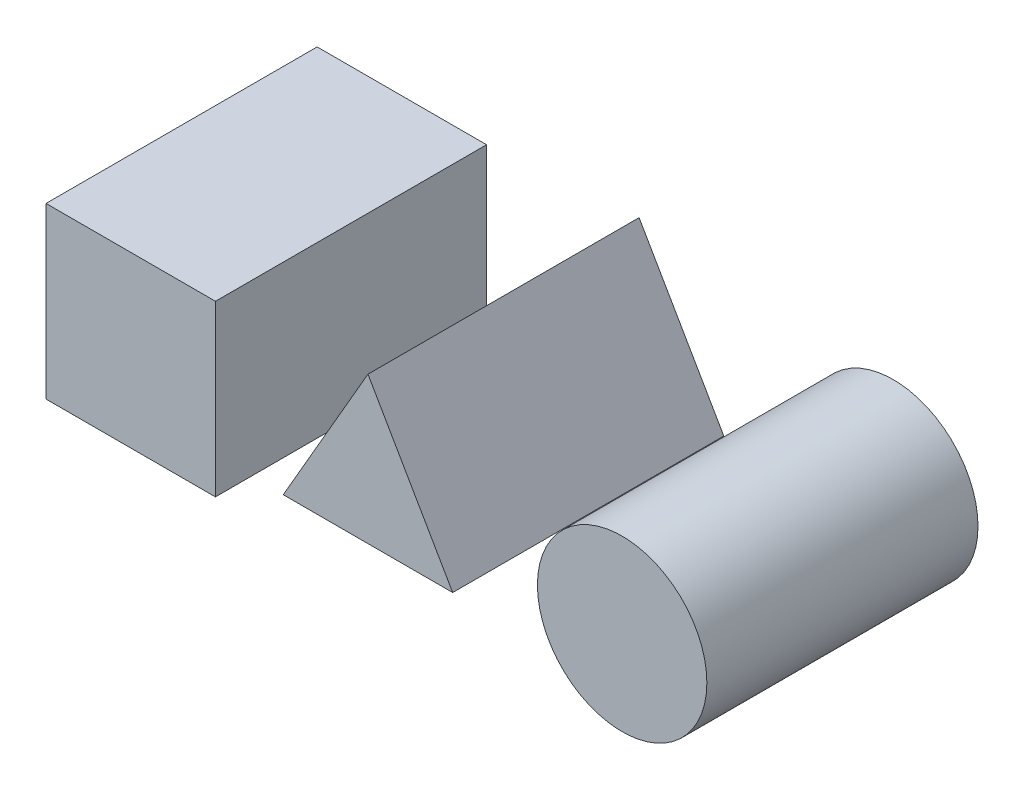
ISO-10303-21;
HEADER;
FILE_DESCRIPTION(('STEP AP214'),'2;1');
FILE_NAME('part.step','',(''),(''),'','','');
FILE_SCHEMA(('AUTOMOTIVE_DESIGN { 1 0 10303 214 1 1 1 1 }'));
ENDSEC;
DATA;
#1=APPLICATION_CONTEXT('core data for automotive mechanical design processes');
#2=APPLICATION_PROTOCOL_DEFINITION('international standard','automotive_design',2000,#1);
#3=PRODUCT_CONTEXT('',#1,'mechanical');
#4=PRODUCT('Part','Part','',(#3));
#5=PRODUCT_RELATED_PRODUCT_CATEGORY('part','',(#4));
#6=PRODUCT_DEFINITION_FORMATION('','',#4);
#7=PRODUCT_DEFINITION_CONTEXT('part definition',#1,'design');
#8=PRODUCT_DEFINITION('design','',#6,#7);
#9=PRODUCT_DEFINITION_SHAPE('','',#8);
#10=(LENGTH_UNIT() NAMED_UNIT(*) SI_UNIT(.MILLI.,.METRE.));
#11=(NAMED_UNIT(*) PLANE_ANGLE_UNIT() SI_UNIT($,.RADIAN.));
#12=(NAMED_UNIT(*) SI_UNIT($,.STERADIAN.) SOLID_ANGLE_UNIT());
#13=UNCERTAINTY_MEASURE_WITH_UNIT(LENGTH_MEASURE(1.E-05),#10,'distance_accuracy_value','');
#14=(GEOMETRIC_REPRESENTATION_CONTEXT(3) GLOBAL_UNCERTAINTY_ASSIGNED_CONTEXT((#13)) GLOBAL_UNIT_ASSIGNED_CONTEXT((#10,
#11,#12)) REPRESENTATION_CONTEXT('',''));
#15=CARTESIAN_POINT('',(0.,0.,0.));
#16=DIRECTION('',(0.,0.,1.));
#17=DIRECTION('',(1.,0.,0.));
#18=AXIS2_PLACEMENT_3D('',#15,#16,#17);
#19=CARTESIAN_POINT('',(74.9999999999999,0.,80.));
#20=DIRECTION('',(0.,0.,-1.));
#21=DIRECTION('',(-1.,0.,0.));
#22=AXIS2_PLACEMENT_3D('',#19,#20,#21);
#23=CYLINDRICAL_SURFACE('',#22,25.);
#24=CARTESIAN_POINT('',(74.9999999999999,0.,80.));
#25=DIRECTION('',(0.,0.,1.));
#26=DIRECTION('',(1.,0.,0.));
#27=AXIS2_PLACEMENT_3D('',#24,#25,#26);
#28=CIRCLE('',#27,25.);
#29=CARTESIAN_POINT('',(99.9999999999999,0.,80.));
#30=VERTEX_POINT('',#29);
#31=EDGE_CURVE('E11',#30,#30,#28,.T.);
#32=ORIENTED_EDGE('',*,*,#31,.F.);
#33=EDGE_LOOP('',(#32));
#34=FACE_BOUND('',#33,.T.);
#35=CARTESIAN_POINT('',(74.9999999999999,0.,0.));
#36=DIRECTION('',(0.,0.,1.));
#37=DIRECTION('',(1.,0.,0.));
#38=AXIS2_PLACEMENT_3D('',#35,#36,#37);
#39=CIRCLE('',#38,25.);
#40=CARTESIAN_POINT('',(99.9999999999999,0.,0.));
#41=VERTEX_POINT('',#40);
#42=EDGE_CURVE('E51',#41,#41,#39,.T.);
#43=ORIENTED_EDGE('',*,*,#42,.T.);
#44=EDGE_LOOP('',(#43));
#45=FACE_BOUND('',#44,.T.);
#46=ADVANCED_FACE('F48',(#34,#45),#23,.T.);
#47=CARTESIAN_POINT('',(0.,0.,80.));
#48=DIRECTION('',(0.,0.,1.));
#49=DIRECTION('',(1.,0.,0.));
#50=AXIS2_PLACEMENT_3D('',#47,#48,#49);
#51=PLANE('',#50);
#52=ORIENTED_EDGE('',*,*,#31,.T.);
#53=EDGE_LOOP('',(#52));
#54=FACE_BOUND('',#53,.T.);
#55=ADVANCED_FACE('F63',(#54),#51,.T.);
#56=CARTESIAN_POINT('',(0.,0.,0.));
#57=DIRECTION('',(0.,0.,1.));
#58=DIRECTION('',(1.,0.,0.));
#59=AXIS2_PLACEMENT_3D('',#56,#57,#58);
#60=PLANE('',#59);
#61=ORIENTED_EDGE('',*,*,#42,.F.);
#62=EDGE_LOOP('',(#61));
#63=FACE_BOUND('',#62,.T.);
#64=ADVANCED_FACE('F61',(#63),#60,.F.);
#65=CLOSED_SHELL('',(#46,#55,#64));
#66=MANIFOLD_SOLID_BREP('B2',#65);
#67=CARTESIAN_POINT('',(-45.,0.,80.));
#68=DIRECTION('',(1.,0.,0.));
#69=DIRECTION('',(0.,0.,-1.));
#70=AXIS2_PLACEMENT_3D('',#67,#68,#69);
#71=PLANE('',#70);
#72=DIRECTION('',(0.,-1.,0.));
#73=VECTOR('',#72,1.);
#74=CARTESIAN_POINT('',(-45.,0.,0.));
#75=LINE('',#74,#73);
#76=CARTESIAN_POINT('',(-45.,25.,0.));
#77=VERTEX_POINT('',#76);
#78=CARTESIAN_POINT('',(-45.,-25.,0.));
#79=VERTEX_POINT('',#78);
#80=EDGE_CURVE('E161',#77,#79,#75,.T.);
#81=ORIENTED_EDGE('',*,*,#80,.F.);
#82=DIRECTION('',(0.,0.,-1.));
#83=VECTOR('',#82,1.);
#84=CARTESIAN_POINT('',(-45.,25.,80.));
#85=LINE('',#84,#83);
#86=CARTESIAN_POINT('',(-45.,25.,80.));
#87=VERTEX_POINT('',#86);
#88=EDGE_CURVE('E46',#87,#77,#85,.T.);
#89=ORIENTED_EDGE('',*,*,#88,.F.);
#90=DIRECTION('',(0.,-1.,0.));
#91=VECTOR('',#90,1.);
#92=CARTESIAN_POINT('',(-45.,0.,80.));
#93=LINE('',#92,#91);
#94=CARTESIAN_POINT('',(-45.,-25.,80.));
#95=VERTEX_POINT('',#94);
#96=EDGE_CURVE('E155',#87,#95,#93,.T.);
#97=ORIENTED_EDGE('',*,*,#96,.T.);
#98=DIRECTION('',(0.,0.,-1.));
#99=VECTOR('',#98,1.);
#100=CARTESIAN_POINT('',(-45.,-25.,80.));
#101=LINE('',#100,#99);
#102=EDGE_CURVE('E136',#95,#79,#101,.T.);
#103=ORIENTED_EDGE('',*,*,#102,.T.);
#104=EDGE_LOOP('',(#81,#89,#97,#103));
#105=FACE_BOUND('',#104,.T.);
#106=ADVANCED_FACE('F98',(#105),#71,.T.);
#107=CARTESIAN_POINT('',(0.,25.,80.));
#108=DIRECTION('',(0.,1.,0.));
#109=DIRECTION('',(0.,0.,1.));
#110=AXIS2_PLACEMENT_3D('',#107,#108,#109);
#111=PLANE('',#110);
#112=DIRECTION('',(1.,0.,0.));
#113=VECTOR('',#112,1.);
#114=CARTESIAN_POINT('',(0.,25.,0.));
#115=LINE('',#114,#113);
#116=CARTESIAN_POINT('',(-95.,25.,0.));
#117=VERTEX_POINT('',#116);
#118=EDGE_CURVE('E149',#117,#77,#115,.T.);
#119=ORIENTED_EDGE('',*,*,#118,.F.);
#120=DIRECTION('',(0.,0.,-1.));
#121=VECTOR('',#120,1.);
#122=CARTESIAN_POINT('',(-95.,25.,80.));
#123=LINE('',#122,#121);
#124=CARTESIAN_POINT('',(-95.,25.,80.));
#125=VERTEX_POINT('',#124);
#126=EDGE_CURVE('E106',#125,#117,#123,.T.);
#127=ORIENTED_EDGE('',*,*,#126,.F.);
#128=DIRECTION('',(1.,0.,0.));
#129=VECTOR('',#128,1.);
#130=CARTESIAN_POINT('',(0.,25.,80.));
#131=LINE('',#130,#129);
#132=EDGE_CURVE('E147',#125,#87,#131,.T.);
#133=ORIENTED_EDGE('',*,*,#132,.T.);
#134=ORIENTED_EDGE('',*,*,#88,.T.);
#135=EDGE_LOOP('',(#119,#127,#133,#134));
#136=FACE_BOUND('',#135,.T.);
#137=ADVANCED_FACE('F145',(#136),#111,.T.);
#138=CARTESIAN_POINT('',(-95.,0.,80.));
#139=DIRECTION('',(1.,0.,0.));
#140=DIRECTION('',(0.,0.,-1.));
#141=AXIS2_PLACEMENT_3D('',#138,#139,#140);
#142=PLANE('',#141);
#143=DIRECTION('',(0.,-1.,0.));
#144=VECTOR('',#143,1.);
#145=CARTESIAN_POINT('',(-95.,0.,0.));
#146=LINE('',#145,#144);
#147=CARTESIAN_POINT('',(-95.,-25.,0.));
#148=VERTEX_POINT('',#147);
#149=EDGE_CURVE('E129',#117,#148,#146,.T.);
#150=ORIENTED_EDGE('',*,*,#149,.T.);
#151=DIRECTION('',(0.,0.,-1.));
#152=VECTOR('',#151,1.);
#153=CARTESIAN_POINT('',(-95.,-25.,80.));
#154=LINE('',#153,#152);
#155=CARTESIAN_POINT('',(-95.,-25.,80.));
#156=VERTEX_POINT('',#155);
#157=EDGE_CURVE('E150',#156,#148,#154,.T.);
#158=ORIENTED_EDGE('',*,*,#157,.F.);
#159=DIRECTION('',(0.,-1.,0.));
#160=VECTOR('',#159,1.);
#161=CARTESIAN_POINT('',(-95.,0.,80.));
#162=LINE('',#161,#160);
#163=EDGE_CURVE('E151',#125,#156,#162,.T.);
#164=ORIENTED_EDGE('',*,*,#163,.F.);
#165=ORIENTED_EDGE('',*,*,#126,.T.);
#166=EDGE_LOOP('',(#150,#158,#164,#165));
#167=FACE_BOUND('',#166,.T.);
#168=ADVANCED_FACE('F152',(#167),#142,.F.);
#169=CARTESIAN_POINT('',(0.,-25.,80.));
#170=DIRECTION('',(0.,1.,0.));
#171=DIRECTION('',(0.,0.,1.));
#172=AXIS2_PLACEMENT_3D('',#169,#170,#171);
#173=PLANE('',#172);
#174=DIRECTION('',(1.,0.,0.));
#175=VECTOR('',#174,1.);
#176=CARTESIAN_POINT('',(0.,-25.,0.));
#177=LINE('',#176,#175);
#178=EDGE_CURVE('E157',#148,#79,#177,.T.);
#179=ORIENTED_EDGE('',*,*,#178,.T.);
#180=ORIENTED_EDGE('',*,*,#102,.F.);
#181=DIRECTION('',(1.,0.,0.));
#182=VECTOR('',#181,1.);
#183=CARTESIAN_POINT('',(0.,-25.,80.));
#184=LINE('',#183,#182);
#185=EDGE_CURVE('E114',#156,#95,#184,.T.);
#186=ORIENTED_EDGE('',*,*,#185,.F.);
#187=ORIENTED_EDGE('',*,*,#157,.T.);
#188=EDGE_LOOP('',(#179,#180,#186,#187));
#189=FACE_BOUND('',#188,.T.);
#190=ADVANCED_FACE('F170',(#189),#173,.F.);
#191=CARTESIAN_POINT('',(0.,0.,80.));
#192=DIRECTION('',(0.,0.,1.));
#193=DIRECTION('',(1.,0.,0.));
#194=AXIS2_PLACEMENT_3D('',#191,#192,#193);
#195=PLANE('',#194);
#196=ORIENTED_EDGE('',*,*,#96,.F.);
#197=ORIENTED_EDGE('',*,*,#132,.F.);
#198=ORIENTED_EDGE('',*,*,#163,.T.);
#199=ORIENTED_EDGE('',*,*,#185,.T.);
#200=EDGE_LOOP('',(#196,#197,#198,#199));
#201=FACE_BOUND('',#200,.T.);
#202=ADVANCED_FACE('F154',(#201),#195,.T.);
#203=CARTESIAN_POINT('',(0.,0.,0.));
#204=DIRECTION('',(0.,0.,1.));
#205=DIRECTION('',(1.,0.,0.));
#206=AXIS2_PLACEMENT_3D('',#203,#204,#205);
#207=PLANE('',#206);
#208=ORIENTED_EDGE('',*,*,#80,.T.);
#209=ORIENTED_EDGE('',*,*,#178,.F.);
#210=ORIENTED_EDGE('',*,*,#149,.F.);
#211=ORIENTED_EDGE('',*,*,#118,.T.);
#212=EDGE_LOOP('',(#208,#209,#210,#211));
#213=FACE_BOUND('',#212,.T.);
#214=ADVANCED_FACE('F172',(#213),#207,.F.);
#215=CLOSED_SHELL('',(#106,#137,#168,#190,#202,#214));
#216=MANIFOLD_SOLID_BREP('B6',#215);
#217=CARTESIAN_POINT('',(0.,-14.4337567297406,80.));
#218=DIRECTION('',(0.,-1.,0.));
#219=DIRECTION('',(1.,0.,0.));
#220=AXIS2_PLACEMENT_3D('',#217,#218,#219);
#221=PLANE('',#220);
#222=DIRECTION('',(-1.,0.,0.));
#223=VECTOR('',#222,1.);
#224=CARTESIAN_POINT('',(0.,-14.4337567297406,0.));
#225=LINE('',#224,#223);
#226=CARTESIAN_POINT('',(25.,-14.4337567297406,0.));
#227=VERTEX_POINT('',#226);
#228=CARTESIAN_POINT('',(-25.,-14.4337567297406,0.));
#229=VERTEX_POINT('',#228);
#230=EDGE_CURVE('E256',#227,#229,#225,.T.);
#231=ORIENTED_EDGE('',*,*,#230,.F.);
#232=DIRECTION('',(0.,0.,-1.));
#233=VECTOR('',#232,1.);
#234=CARTESIAN_POINT('',(25.,-14.4337567297406,80.));
#235=LINE('',#234,#233);
#236=CARTESIAN_POINT('',(25.,-14.4337567297406,80.));
#237=VERTEX_POINT('',#236);
#238=EDGE_CURVE('E96',#237,#227,#235,.T.);
#239=ORIENTED_EDGE('',*,*,#238,.F.);
#240=DIRECTION('',(-1.,0.,0.));
#241=VECTOR('',#240,1.);
#242=CARTESIAN_POINT('',(0.,-14.4337567297406,80.));
#243=LINE('',#242,#241);
#244=CARTESIAN_POINT('',(-25.,-14.4337567297406,80.));
#245=VERTEX_POINT('',#244);
#246=EDGE_CURVE('E254',#237,#245,#243,.T.);
#247=ORIENTED_EDGE('',*,*,#246,.T.);
#248=DIRECTION('',(0.,0.,-1.));
#249=VECTOR('',#248,1.);
#250=CARTESIAN_POINT('',(-25.,-14.4337567297406,80.));
#251=LINE('',#250,#249);
#252=EDGE_CURVE('E238',#245,#229,#251,.T.);
#253=ORIENTED_EDGE('',*,*,#252,.T.);
#254=EDGE_LOOP('',(#231,#239,#247,#253));
#255=FACE_BOUND('',#254,.T.);
#256=ADVANCED_FACE('F222',(#255),#221,.T.);
#257=CARTESIAN_POINT('',(12.5,7.21687836487032,80.));
#258=DIRECTION('',(0.866025403784439,0.5,0.));
#259=DIRECTION('',(-0.5,0.866025403784439,0.));
#260=AXIS2_PLACEMENT_3D('',#257,#258,#259);
#261=PLANE('',#260);
#262=DIRECTION('',(0.5,-0.866025403784439,0.));
#263=VECTOR('',#262,1.);
#264=CARTESIAN_POINT('',(12.5,7.21687836487032,0.));
#265=LINE('',#264,#263);
#266=CARTESIAN_POINT('',(0.,28.8675134594813,0.));
#267=VERTEX_POINT('',#266);
#268=EDGE_CURVE('E272',#267,#227,#265,.T.);
#269=ORIENTED_EDGE('',*,*,#268,.F.);
#270=DIRECTION('',(0.,0.,-1.));
#271=VECTOR('',#270,1.);
#272=CARTESIAN_POINT('',(0.,28.8675134594813,80.));
#273=LINE('',#272,#271);
#274=CARTESIAN_POINT('',(0.,28.8675134594813,80.));
#275=VERTEX_POINT('',#274);
#276=EDGE_CURVE('E230',#275,#267,#273,.T.);
#277=ORIENTED_EDGE('',*,*,#276,.F.);
#278=DIRECTION('',(0.5,-0.866025403784439,0.));
#279=VECTOR('',#278,1.);
#280=CARTESIAN_POINT('',(12.5,7.21687836487032,80.));
#281=LINE('',#280,#279);
#282=EDGE_CURVE('E263',#275,#237,#281,.T.);
#283=ORIENTED_EDGE('',*,*,#282,.T.);
#284=ORIENTED_EDGE('',*,*,#238,.T.);
#285=EDGE_LOOP('',(#269,#277,#283,#284));
#286=FACE_BOUND('',#285,.T.);
#287=ADVANCED_FACE('F267',(#286),#261,.T.);
#288=CARTESIAN_POINT('',(-12.5,7.21687836487033,80.));
#289=DIRECTION('',(-0.866025403784439,0.5,0.));
#290=DIRECTION('',(-0.5,-0.866025403784439,0.));
#291=AXIS2_PLACEMENT_3D('',#288,#289,#290);
#292=PLANE('',#291);
#293=DIRECTION('',(0.5,0.866025403784439,0.));
#294=VECTOR('',#293,1.);
#295=CARTESIAN_POINT('',(-12.5,7.21687836487033,0.));
#296=LINE('',#295,#294);
#297=EDGE_CURVE('E265',#229,#267,#296,.T.);
#298=ORIENTED_EDGE('',*,*,#297,.F.);
#299=ORIENTED_EDGE('',*,*,#252,.F.);
#300=DIRECTION('',(0.5,0.866025403784439,0.));
#301=VECTOR('',#300,1.);
#302=CARTESIAN_POINT('',(-12.5,7.21687836487033,80.));
#303=LINE('',#302,#301);
#304=EDGE_CURVE('E264',#245,#275,#303,.T.);
#305=ORIENTED_EDGE('',*,*,#304,.T.);
#306=ORIENTED_EDGE('',*,*,#276,.T.);
#307=EDGE_LOOP('',(#298,#299,#305,#306));
#308=FACE_BOUND('',#307,.T.);
#309=ADVANCED_FACE('F278',(#308),#292,.T.);
#310=CARTESIAN_POINT('',(0.,0.,80.));
#311=DIRECTION('',(0.,0.,1.));
#312=DIRECTION('',(1.,0.,0.));
#313=AXIS2_PLACEMENT_3D('',#310,#311,#312);
#314=PLANE('',#313);
#315=ORIENTED_EDGE('',*,*,#246,.F.);
#316=ORIENTED_EDGE('',*,*,#282,.F.);
#317=ORIENTED_EDGE('',*,*,#304,.F.);
#318=EDGE_LOOP('',(#315,#316,#317));
#319=FACE_BOUND('',#318,.T.);
#320=ADVANCED_FACE('F262',(#319),#314,.T.);
#321=CARTESIAN_POINT('',(0.,0.,0.));
#322=DIRECTION('',(0.,0.,1.));
#323=DIRECTION('',(1.,0.,0.));
#324=AXIS2_PLACEMENT_3D('',#321,#322,#323);
#325=PLANE('',#324);
#326=ORIENTED_EDGE('',*,*,#230,.T.);
#327=ORIENTED_EDGE('',*,*,#297,.T.);
#328=ORIENTED_EDGE('',*,*,#268,.T.);
#329=EDGE_LOOP('',(#326,#327,#328));
#330=FACE_BOUND('',#329,.T.);
#331=ADVANCED_FACE('F277',(#330),#325,.F.);
#332=CLOSED_SHELL('',(#256,#287,#309,#320,#331));
#333=MANIFOLD_SOLID_BREP('B40',#332);
#334=ADVANCED_BREP_SHAPE_REPRESENTATION('',(#18,#66,#216,#333),#14);
#335=SHAPE_DEFINITION_REPRESENTATION(#9,#334);
ENDSEC;
END-ISO-10303-21;
